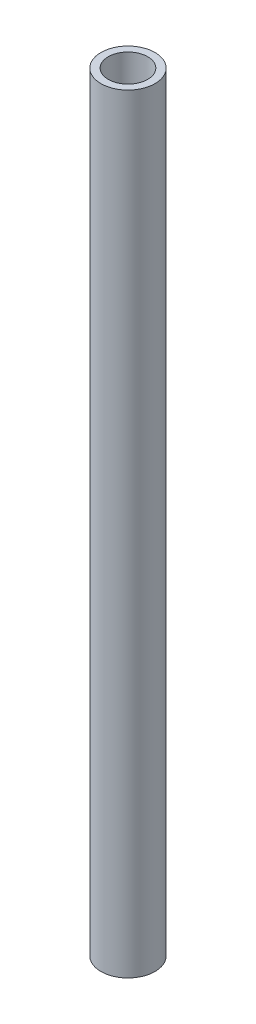
ISO-10303-21;
HEADER;
FILE_DESCRIPTION(('STEP AP214'),'2;1');
FILE_NAME('part.step','',(''),(''),'','','');
FILE_SCHEMA(('AUTOMOTIVE_DESIGN { 1 0 10303 214 1 1 1 1 }'));
ENDSEC;
DATA;
#1=APPLICATION_CONTEXT('core data for automotive mechanical design processes');
#2=APPLICATION_PROTOCOL_DEFINITION('international standard','automotive_design',2000,#1);
#3=PRODUCT_CONTEXT('',#1,'mechanical');
#4=PRODUCT('Part','Part','',(#3));
#5=PRODUCT_RELATED_PRODUCT_CATEGORY('part','',(#4));
#6=PRODUCT_DEFINITION_FORMATION('','',#4);
#7=PRODUCT_DEFINITION_CONTEXT('part definition',#1,'design');
#8=PRODUCT_DEFINITION('design','',#6,#7);
#9=PRODUCT_DEFINITION_SHAPE('','',#8);
#10=(LENGTH_UNIT() NAMED_UNIT(*) SI_UNIT(.MILLI.,.METRE.));
#11=(NAMED_UNIT(*) PLANE_ANGLE_UNIT() SI_UNIT($,.RADIAN.));
#12=(NAMED_UNIT(*) SI_UNIT($,.STERADIAN.) SOLID_ANGLE_UNIT());
#13=UNCERTAINTY_MEASURE_WITH_UNIT(LENGTH_MEASURE(1.E-05),#10,'distance_accuracy_value','');
#14=(GEOMETRIC_REPRESENTATION_CONTEXT(3) GLOBAL_UNCERTAINTY_ASSIGNED_CONTEXT((#13)) GLOBAL_UNIT_ASSIGNED_CONTEXT((#10,
#11,#12)) REPRESENTATION_CONTEXT('',''));
#15=CARTESIAN_POINT('',(0.,0.,0.));
#16=DIRECTION('',(0.,0.,1.));
#17=DIRECTION('',(1.,0.,0.));
#18=AXIS2_PLACEMENT_3D('',#15,#16,#17);
#19=CARTESIAN_POINT('',(0.,121.,0.));
#20=DIRECTION('',(0.,1.,0.));
#21=DIRECTION('',(0.,0.,1.));
#22=AXIS2_PLACEMENT_3D('',#19,#20,#21);
#23=PLANE('',#22);
#24=CARTESIAN_POINT('',(0.,121.,0.));
#25=DIRECTION('',(0.,1.,0.));
#26=DIRECTION('',(0.,0.,1.));
#27=AXIS2_PLACEMENT_3D('',#24,#25,#26);
#28=CIRCLE('',#27,4.25);
#29=CARTESIAN_POINT('',(0.,121.,4.25));
#30=VERTEX_POINT('',#29);
#31=EDGE_CURVE('E10',#30,#30,#28,.T.);
#32=ORIENTED_EDGE('',*,*,#31,.T.);
#33=EDGE_LOOP('',(#32));
#34=FACE_BOUND('',#33,.T.);
#35=CARTESIAN_POINT('',(0.,121.,0.));
#36=DIRECTION('',(0.,1.,0.));
#37=DIRECTION('',(0.,0.,1.));
#38=AXIS2_PLACEMENT_3D('',#35,#36,#37);
#39=CIRCLE('',#38,3.1);
#40=CARTESIAN_POINT('',(0.,121.,3.1));
#41=VERTEX_POINT('',#40);
#42=EDGE_CURVE('E50',#41,#41,#39,.T.);
#43=ORIENTED_EDGE('',*,*,#42,.F.);
#44=EDGE_LOOP('',(#43));
#45=FACE_BOUND('',#44,.T.);
#46=ADVANCED_FACE('F37',(#34,#45),#23,.T.);
#47=CARTESIAN_POINT('',(0.,0.,0.));
#48=DIRECTION('',(0.,1.,0.));
#49=DIRECTION('',(0.,0.,1.));
#50=AXIS2_PLACEMENT_3D('',#47,#48,#49);
#51=PLANE('',#50);
#52=CARTESIAN_POINT('',(0.,0.,0.));
#53=DIRECTION('',(0.,1.,0.));
#54=DIRECTION('',(0.,0.,1.));
#55=AXIS2_PLACEMENT_3D('',#52,#53,#54);
#56=CIRCLE('',#55,4.25);
#57=CARTESIAN_POINT('',(0.,0.,4.25));
#58=VERTEX_POINT('',#57);
#59=EDGE_CURVE('E41',#58,#58,#56,.T.);
#60=ORIENTED_EDGE('',*,*,#59,.F.);
#61=EDGE_LOOP('',(#60));
#62=FACE_BOUND('',#61,.T.);
#63=CARTESIAN_POINT('',(0.,0.,0.));
#64=DIRECTION('',(0.,1.,0.));
#65=DIRECTION('',(0.,0.,1.));
#66=AXIS2_PLACEMENT_3D('',#63,#64,#65);
#67=CIRCLE('',#66,3.1);
#68=CARTESIAN_POINT('',(0.,0.,3.1));
#69=VERTEX_POINT('',#68);
#70=EDGE_CURVE('E52',#69,#69,#67,.T.);
#71=ORIENTED_EDGE('',*,*,#70,.T.);
#72=EDGE_LOOP('',(#71));
#73=FACE_BOUND('',#72,.T.);
#74=ADVANCED_FACE('F64',(#62,#73),#51,.F.);
#75=CARTESIAN_POINT('',(0.,121.,0.));
#76=DIRECTION('',(0.,-1.,0.));
#77=DIRECTION('',(0.,0.,-1.));
#78=AXIS2_PLACEMENT_3D('',#75,#76,#77);
#79=CYLINDRICAL_SURFACE('',#78,4.25);
#80=ORIENTED_EDGE('',*,*,#31,.F.);
#81=EDGE_LOOP('',(#80));
#82=FACE_BOUND('',#81,.T.);
#83=ORIENTED_EDGE('',*,*,#59,.T.);
#84=EDGE_LOOP('',(#83));
#85=FACE_BOUND('',#84,.T.);
#86=ADVANCED_FACE('F39',(#82,#85),#79,.T.);
#87=CARTESIAN_POINT('',(0.,121.,0.));
#88=DIRECTION('',(0.,-1.,0.));
#89=DIRECTION('',(0.,0.,-1.));
#90=AXIS2_PLACEMENT_3D('',#87,#88,#89);
#91=CYLINDRICAL_SURFACE('',#90,3.1);
#92=ORIENTED_EDGE('',*,*,#42,.T.);
#93=EDGE_LOOP('',(#92));
#94=FACE_BOUND('',#93,.T.);
#95=ORIENTED_EDGE('',*,*,#70,.F.);
#96=EDGE_LOOP('',(#95));
#97=FACE_BOUND('',#96,.T.);
#98=ADVANCED_FACE('F60',(#94,#97),#91,.F.);
#99=CLOSED_SHELL('',(#46,#74,#86,#98));
#100=MANIFOLD_SOLID_BREP('B2',#99);
#101=ADVANCED_BREP_SHAPE_REPRESENTATION('',(#18,#100),#14);
#102=SHAPE_DEFINITION_REPRESENTATION(#9,#101);
ENDSEC;
END-ISO-10303-21;
